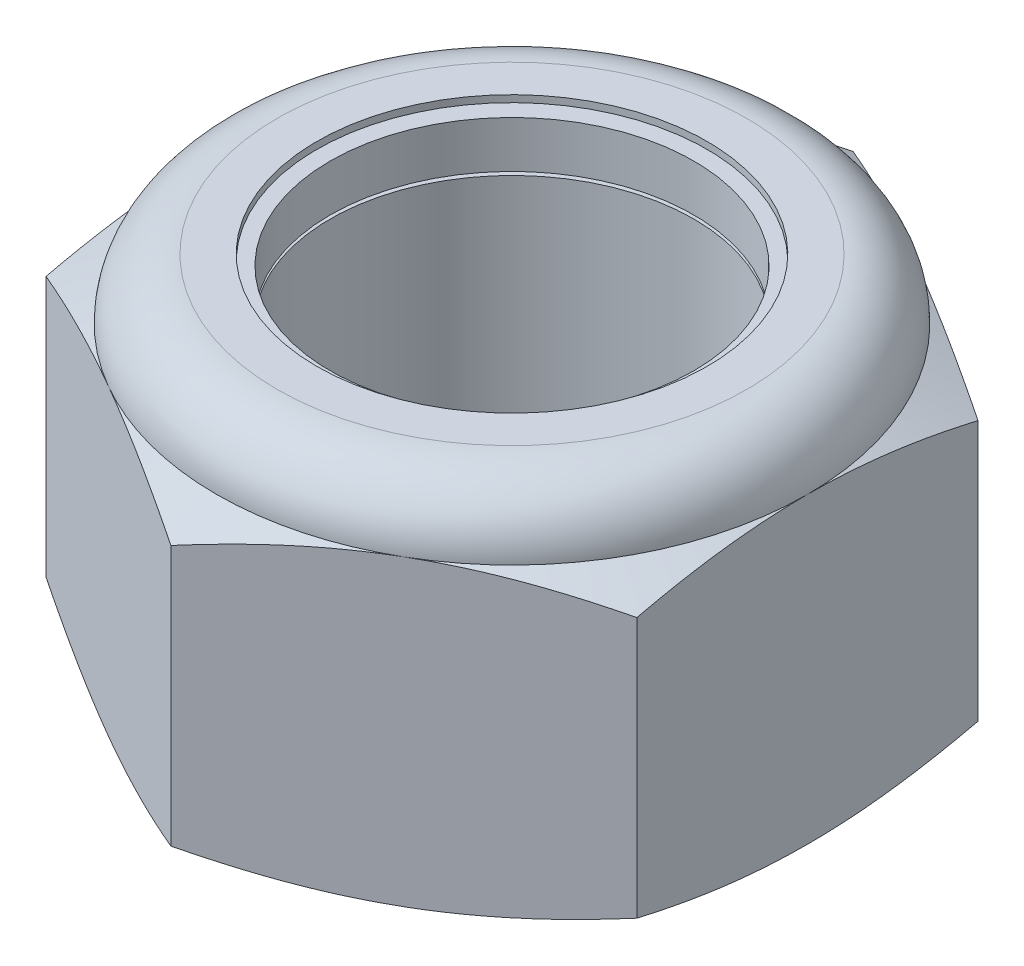
ISO-10303-21;
HEADER;
FILE_DESCRIPTION(('STEP AP214'),'2;1');
FILE_NAME('part.step','',(''),(''),'','','');
FILE_SCHEMA(('AUTOMOTIVE_DESIGN { 1 0 10303 214 1 1 1 1 }'));
ENDSEC;
DATA;
#1=APPLICATION_CONTEXT('core data for automotive mechanical design processes');
#2=APPLICATION_PROTOCOL_DEFINITION('international standard','automotive_design',2000,#1);
#3=PRODUCT_CONTEXT('',#1,'mechanical');
#4=PRODUCT('Part','Part','',(#3));
#5=PRODUCT_RELATED_PRODUCT_CATEGORY('part','',(#4));
#6=PRODUCT_DEFINITION_FORMATION('','',#4);
#7=PRODUCT_DEFINITION_CONTEXT('part definition',#1,'design');
#8=PRODUCT_DEFINITION('design','',#6,#7);
#9=PRODUCT_DEFINITION_SHAPE('','',#8);
#10=(LENGTH_UNIT() NAMED_UNIT(*) SI_UNIT(.MILLI.,.METRE.));
#11=(NAMED_UNIT(*) PLANE_ANGLE_UNIT() SI_UNIT($,.RADIAN.));
#12=(NAMED_UNIT(*) SI_UNIT($,.STERADIAN.) SOLID_ANGLE_UNIT());
#13=UNCERTAINTY_MEASURE_WITH_UNIT(LENGTH_MEASURE(1.E-05),#10,'distance_accuracy_value','');
#14=(GEOMETRIC_REPRESENTATION_CONTEXT(3) GLOBAL_UNCERTAINTY_ASSIGNED_CONTEXT((#13)) GLOBAL_UNIT_ASSIGNED_CONTEXT((#10,
#11,#12)) REPRESENTATION_CONTEXT('',''));
#15=CARTESIAN_POINT('',(0.,0.,0.));
#16=DIRECTION('',(0.,0.,1.));
#17=DIRECTION('',(1.,0.,0.));
#18=AXIS2_PLACEMENT_3D('',#15,#16,#17);
#19=CARTESIAN_POINT('',(0.,7.8476,-5.16666666666667));
#20=DIRECTION('',(0.,1.,0.));
#21=DIRECTION('',(0.,0.,-1.));
#22=AXIS2_PLACEMENT_3D('',#19,#20,#21);
#23=PLANE('',#22);
#24=CARTESIAN_POINT('',(0.,7.8476,0.));
#25=DIRECTION('',(0.,-1.,0.));
#26=DIRECTION('',(0.,0.,-1.));
#27=AXIS2_PLACEMENT_3D('',#24,#25,#26);
#28=CIRCLE('',#27,4.29131001134832);
#29=CARTESIAN_POINT('',(0.,7.8476,4.29131001134831));
#30=VERTEX_POINT('',#29);
#31=EDGE_CURVE('P0_E288',#30,#30,#28,.T.);
#32=ORIENTED_EDGE('',*,*,#31,.F.);
#33=EDGE_LOOP('',(#32));
#34=FACE_BOUND('',#33,.T.);
#35=CARTESIAN_POINT('',(0.,7.8476,0.));
#36=DIRECTION('',(0.,-1.,0.));
#37=DIRECTION('',(0.,0.,-1.));
#38=AXIS2_PLACEMENT_3D('',#35,#36,#37);
#39=CIRCLE('',#38,5.16666666666667);
#40=CARTESIAN_POINT('',(0.,7.8476,5.16666666666667));
#41=VERTEX_POINT('',#40);
#42=EDGE_CURVE('P0_E290',#41,#41,#39,.T.);
#43=ORIENTED_EDGE('',*,*,#42,.T.);
#44=EDGE_LOOP('',(#43));
#45=FACE_BOUND('',#44,.T.);
#46=ADVANCED_FACE('P0_F16',(#34,#45),#23,.F.);
#47=CARTESIAN_POINT('',(6.5,8.,-3.75277674973258));
#48=DIRECTION('',(-0.5,0.,0.866025403784439));
#49=DIRECTION('',(0.,1.,0.));
#50=AXIS2_PLACEMENT_3D('',#47,#48,#49);
#51=PLANE('',#50);
#52=DIRECTION('',(0.,-1.,0.));
#53=VECTOR('',#52,1.);
#54=CARTESIAN_POINT('',(0.,8.,-7.50555349946514));
#55=LINE('',#54,#53);
#56=CARTESIAN_POINT('',(0.,6.19776936918152,-7.50555349946514));
#57=VERTEX_POINT('',#56);
#58=CARTESIAN_POINT('',(0.,0.468897297485155,-7.50555349946514));
#59=VERTEX_POINT('',#58);
#60=EDGE_CURVE('P0_E11',#57,#59,#55,.T.);
#61=ORIENTED_EDGE('',*,*,#60,.F.);
#62=CARTESIAN_POINT('',(-8.11402595225573E-12,6.19776936917933,-7.50555349946982));
#63=CARTESIAN_POINT('',(1.74166975079905,6.66666666666667,-6.50000000000188));
#64=CARTESIAN_POINT('',(3.25000000000002,6.66666666666667,-5.62916512459884));
#65=(BOUNDED_CURVE() B_SPLINE_CURVE(2,(#62,#63,#64),.UNSPECIFIED.,.F.,
.F.) B_SPLINE_CURVE_WITH_KNOTS((3,3),(1.49446607017309,2.3298655330262),
.UNSPECIFIED.) CURVE() GEOMETRIC_REPRESENTATION_ITEM() RATIONAL_B_SPLINE_CURVE((2.10211040392093,
2.26470920953128,2.26470920953128)) REPRESENTATION_ITEM(''));
#66=CARTESIAN_POINT('',(3.25,6.66666666666667,-5.62916512459886));
#67=VERTEX_POINT('',#66);
#68=EDGE_CURVE('P0_E401',#57,#67,#65,.T.);
#69=ORIENTED_EDGE('',*,*,#68,.T.);
#70=CARTESIAN_POINT('',(3.25,6.66666666666667,-5.62916512459884));
#71=CARTESIAN_POINT('',(4.75833024920097,6.66666666666667,-4.75833024919583));
#72=CARTESIAN_POINT('',(6.50000000000809,6.19776936917933,-3.7527767497279));
#73=(BOUNDED_CURVE() B_SPLINE_CURVE(2,(#70,#71,#72),.UNSPECIFIED.,.F.,
.F.) B_SPLINE_CURVE_WITH_KNOTS((3,3),(2.32986553302619,3.16526499587929),
.UNSPECIFIED.) CURVE() GEOMETRIC_REPRESENTATION_ITEM() RATIONAL_B_SPLINE_CURVE((2.26470920953128,
2.26470920953128,2.10211040392093)) REPRESENTATION_ITEM(''));
#74=CARTESIAN_POINT('',(6.5,6.19776936918152,-3.75277674973259));
#75=VERTEX_POINT('',#74);
#76=EDGE_CURVE('P0_E247',#67,#75,#73,.T.);
#77=ORIENTED_EDGE('',*,*,#76,.T.);
#78=DIRECTION('',(0.,-1.,0.));
#79=VECTOR('',#78,1.);
#80=CARTESIAN_POINT('',(6.5,8.,-3.75277674973258));
#81=LINE('',#80,#79);
#82=CARTESIAN_POINT('',(6.5,0.468897297485152,-3.75277674973258));
#83=VERTEX_POINT('',#82);
#84=EDGE_CURVE('P0_E338',#75,#83,#81,.T.);
#85=ORIENTED_EDGE('',*,*,#84,.T.);
#86=CARTESIAN_POINT('',(6.5000000000081,0.468897297487334,-3.75277674972789));
#87=CARTESIAN_POINT('',(4.75833024920096,0.,-4.75833024919583));
#88=CARTESIAN_POINT('',(3.25,0.,-5.62916512459886));
#89=(BOUNDED_CURVE() B_SPLINE_CURVE(2,(#86,#87,#88),.UNSPECIFIED.,.F.,
.F.) B_SPLINE_CURVE_WITH_KNOTS((3,3),(1.49446607017308,2.32986553302618),
.UNSPECIFIED.) CURVE() GEOMETRIC_REPRESENTATION_ITEM() RATIONAL_B_SPLINE_CURVE((2.10211040392092,
2.26470920953127,2.26470920953127)) REPRESENTATION_ITEM(''));
#90=CARTESIAN_POINT('',(3.25,0.,-5.62916512459885));
#91=VERTEX_POINT('',#90);
#92=EDGE_CURVE('P0_E264',#83,#91,#89,.T.);
#93=ORIENTED_EDGE('',*,*,#92,.T.);
#94=CARTESIAN_POINT('',(3.25,0.,-5.62916512459886));
#95=CARTESIAN_POINT('',(1.74166975079904,0.,-6.50000000000189));
#96=CARTESIAN_POINT('',(-8.11191336478642E-12,0.468897297487337,-7.50555349946983));
#97=(BOUNDED_CURVE() B_SPLINE_CURVE(2,(#94,#95,#96),.UNSPECIFIED.,.F.,
.F.) B_SPLINE_CURVE_WITH_KNOTS((3,3),(2.32986553302618,3.16526499587928),
.UNSPECIFIED.) CURVE() GEOMETRIC_REPRESENTATION_ITEM() RATIONAL_B_SPLINE_CURVE((2.26470920953127,
2.26470920953127,2.10211040392092)) REPRESENTATION_ITEM(''));
#98=EDGE_CURVE('P0_E403',#91,#59,#97,.T.);
#99=ORIENTED_EDGE('',*,*,#98,.T.);
#100=EDGE_LOOP('',(#61,#69,#77,#85,#93,#99));
#101=FACE_BOUND('',#100,.T.);
#102=ADVANCED_FACE('P0_F500',(#101),#51,.F.);
#103=CARTESIAN_POINT('',(0.,8.,-7.50555349946514));
#104=DIRECTION('',(0.5,0.,0.866025403784439));
#105=DIRECTION('',(0.,-1.,0.));
#106=AXIS2_PLACEMENT_3D('',#103,#104,#105);
#107=PLANE('',#106);
#108=DIRECTION('',(0.,-1.,0.));
#109=VECTOR('',#108,1.);
#110=CARTESIAN_POINT('',(-6.5,8.,-3.75277674973257));
#111=LINE('',#110,#109);
#112=CARTESIAN_POINT('',(-6.5,6.19776936918152,-3.75277674973258));
#113=VERTEX_POINT('',#112);
#114=CARTESIAN_POINT('',(-6.5,0.468897297485155,-3.75277674973258));
#115=VERTEX_POINT('',#114);
#116=EDGE_CURVE('P0_E30',#113,#115,#111,.T.);
#117=ORIENTED_EDGE('',*,*,#116,.F.);
#118=CARTESIAN_POINT('',(-6.50000000000811,6.19776936917933,-3.75277674972789));
#119=CARTESIAN_POINT('',(-4.75833024920097,6.66666666666667,-4.75833024919583));
#120=CARTESIAN_POINT('',(-3.25,6.66666666666667,-5.62916512459886));
#121=(BOUNDED_CURVE() B_SPLINE_CURVE(2,(#118,#119,#120),.UNSPECIFIED.,.F.,
.F.) B_SPLINE_CURVE_WITH_KNOTS((3,3),(1.49446607017309,2.3298655330262),
.UNSPECIFIED.) CURVE() GEOMETRIC_REPRESENTATION_ITEM() RATIONAL_B_SPLINE_CURVE((2.10211040392093,
2.26470920953128,2.26470920953128)) REPRESENTATION_ITEM(''));
#122=CARTESIAN_POINT('',(-3.25,6.66666666666667,-5.62916512459886));
#123=VERTEX_POINT('',#122);
#124=EDGE_CURVE('P0_E206',#113,#123,#121,.T.);
#125=ORIENTED_EDGE('',*,*,#124,.T.);
#126=CARTESIAN_POINT('',(-3.25,6.66666666666667,-5.62916512459886));
#127=CARTESIAN_POINT('',(-1.74166975079904,6.66666666666667,-6.50000000000189));
#128=CARTESIAN_POINT('',(8.10135042743967E-12,6.19776936917933,-7.50555349946982));
#129=(BOUNDED_CURVE() B_SPLINE_CURVE(2,(#126,#127,#128),.UNSPECIFIED.,.F.,
.F.) B_SPLINE_CURVE_WITH_KNOTS((3,3),(2.3298655330262,3.16526499587929),
.UNSPECIFIED.) CURVE() GEOMETRIC_REPRESENTATION_ITEM() RATIONAL_B_SPLINE_CURVE((2.26470920953128,
2.26470920953128,2.10211040392093)) REPRESENTATION_ITEM(''));
#130=EDGE_CURVE('P0_E222',#123,#57,#129,.T.);
#131=ORIENTED_EDGE('',*,*,#130,.T.);
#132=ORIENTED_EDGE('',*,*,#60,.T.);
#133=CARTESIAN_POINT('',(8.10895574232937E-12,0.468897297487338,-7.50555349946983));
#134=CARTESIAN_POINT('',(-1.74166975079904,0.,-6.50000000000189));
#135=CARTESIAN_POINT('',(-3.25,0.,-5.62916512459886));
#136=(BOUNDED_CURVE() B_SPLINE_CURVE(2,(#133,#134,#135),.UNSPECIFIED.,.F.,
.F.) B_SPLINE_CURVE_WITH_KNOTS((3,3),(1.49446607017308,2.32986553302618),
.UNSPECIFIED.) CURVE() GEOMETRIC_REPRESENTATION_ITEM() RATIONAL_B_SPLINE_CURVE((2.10211040392092,
2.26470920953127,2.26470920953127)) REPRESENTATION_ITEM(''));
#137=CARTESIAN_POINT('',(-3.25,0.,-5.62916512459886));
#138=VERTEX_POINT('',#137);
#139=EDGE_CURVE('P0_E273',#59,#138,#136,.T.);
#140=ORIENTED_EDGE('',*,*,#139,.T.);
#141=CARTESIAN_POINT('',(-3.25,0.,-5.62916512459886));
#142=CARTESIAN_POINT('',(-4.75833024920096,0.,-4.75833024919583));
#143=CARTESIAN_POINT('',(-6.50000000000811,0.468897297487337,-3.75277674972789));
#144=(BOUNDED_CURVE() B_SPLINE_CURVE(2,(#141,#142,#143),.UNSPECIFIED.,.F.,
.F.) B_SPLINE_CURVE_WITH_KNOTS((3,3),(2.32986553302618,3.16526499587928),
.UNSPECIFIED.) CURVE() GEOMETRIC_REPRESENTATION_ITEM() RATIONAL_B_SPLINE_CURVE((2.26470920953127,
2.26470920953127,2.10211040392092)) REPRESENTATION_ITEM(''));
#145=EDGE_CURVE('P0_E228',#138,#115,#144,.T.);
#146=ORIENTED_EDGE('',*,*,#145,.T.);
#147=EDGE_LOOP('',(#117,#125,#131,#132,#140,#146));
#148=FACE_BOUND('',#147,.T.);
#149=ADVANCED_FACE('P0_F508',(#148),#107,.F.);
#150=CARTESIAN_POINT('',(-6.5,8.,-3.75277674973257));
#151=DIRECTION('',(1.,0.,0.));
#152=DIRECTION('',(0.,1.,0.));
#153=AXIS2_PLACEMENT_3D('',#150,#151,#152);
#154=PLANE('',#153);
#155=DIRECTION('',(0.,-1.,0.));
#156=VECTOR('',#155,1.);
#157=CARTESIAN_POINT('',(-6.5,8.,3.75277674973256));
#158=LINE('',#157,#156);
#159=CARTESIAN_POINT('',(-6.5,6.19776936918152,3.75277674973256));
#160=VERTEX_POINT('',#159);
#161=CARTESIAN_POINT('',(-6.5,0.468897297485155,3.75277674973256));
#162=VERTEX_POINT('',#161);
#163=EDGE_CURVE('P0_E91',#160,#162,#158,.T.);
#164=ORIENTED_EDGE('',*,*,#163,.F.);
#165=CARTESIAN_POINT('',(-6.5,6.19776936917933,3.75277674974192));
#166=CARTESIAN_POINT('',(-6.5,6.66666666666667,1.74166975080605));
#167=CARTESIAN_POINT('',(-6.5,6.66666666666667,0.));
#168=(BOUNDED_CURVE() B_SPLINE_CURVE(2,(#165,#166,#167),.UNSPECIFIED.,.F.,
.F.) B_SPLINE_CURVE_WITH_KNOTS((3,3),(1.49446607017309,2.3298655330262),
.UNSPECIFIED.) CURVE() GEOMETRIC_REPRESENTATION_ITEM() RATIONAL_B_SPLINE_CURVE((2.10211040392093,
2.26470920953128,2.26470920953128)) REPRESENTATION_ITEM(''));
#169=CARTESIAN_POINT('',(-6.5,6.66666666666667,0.));
#170=VERTEX_POINT('',#169);
#171=EDGE_CURVE('P0_E215',#160,#170,#168,.T.);
#172=ORIENTED_EDGE('',*,*,#171,.T.);
#173=CARTESIAN_POINT('',(-6.5,6.66666666666667,0.));
#174=CARTESIAN_POINT('',(-6.5,6.66666666666667,-1.74166975080608));
#175=CARTESIAN_POINT('',(-6.50000000000001,6.19776936917933,-3.75277674974195));
#176=(BOUNDED_CURVE() B_SPLINE_CURVE(2,(#173,#174,#175),.UNSPECIFIED.,.F.,
.F.) B_SPLINE_CURVE_WITH_KNOTS((3,3),(2.3298655330262,3.1652649958793),
.UNSPECIFIED.) CURVE() GEOMETRIC_REPRESENTATION_ITEM() RATIONAL_B_SPLINE_CURVE((2.26470920953128,
2.26470920953128,2.10211040392093)) REPRESENTATION_ITEM(''));
#177=EDGE_CURVE('P0_E113',#170,#113,#176,.T.);
#178=ORIENTED_EDGE('',*,*,#177,.T.);
#179=ORIENTED_EDGE('',*,*,#116,.T.);
#180=CARTESIAN_POINT('',(-6.5,0.468897297487338,-3.75277674974194));
#181=CARTESIAN_POINT('',(-6.5,0.,-1.74166975080607));
#182=CARTESIAN_POINT('',(-6.5,0.,0.));
#183=(BOUNDED_CURVE() B_SPLINE_CURVE(2,(#180,#181,#182),.UNSPECIFIED.,.F.,
.F.) B_SPLINE_CURVE_WITH_KNOTS((3,3),(1.49446607017308,2.32986553302618),
.UNSPECIFIED.) CURVE() GEOMETRIC_REPRESENTATION_ITEM() RATIONAL_B_SPLINE_CURVE((2.10211040392092,
2.26470920953127,2.26470920953127)) REPRESENTATION_ITEM(''));
#184=CARTESIAN_POINT('',(-6.5,0.,0.));
#185=VERTEX_POINT('',#184);
#186=EDGE_CURVE('P0_E240',#115,#185,#183,.T.);
#187=ORIENTED_EDGE('',*,*,#186,.T.);
#188=CARTESIAN_POINT('',(-6.5,0.,0.));
#189=CARTESIAN_POINT('',(-6.5,0.,1.74166975080605));
#190=CARTESIAN_POINT('',(-6.5,0.468897297487331,3.75277674974191));
#191=(BOUNDED_CURVE() B_SPLINE_CURVE(2,(#188,#189,#190),.UNSPECIFIED.,.F.,
.F.) B_SPLINE_CURVE_WITH_KNOTS((3,3),(2.32986553302618,3.16526499587927),
.UNSPECIFIED.) CURVE() GEOMETRIC_REPRESENTATION_ITEM() RATIONAL_B_SPLINE_CURVE((2.26470920953127,
2.26470920953127,2.10211040392092)) REPRESENTATION_ITEM(''));
#192=EDGE_CURVE('P0_E312',#185,#162,#191,.T.);
#193=ORIENTED_EDGE('',*,*,#192,.T.);
#194=EDGE_LOOP('',(#164,#172,#178,#179,#187,#193));
#195=FACE_BOUND('',#194,.T.);
#196=ADVANCED_FACE('P0_F812',(#195),#154,.F.);
#197=CARTESIAN_POINT('',(-6.5,8.,3.75277674973256));
#198=DIRECTION('',(0.5,0.,-0.866025403784439));
#199=DIRECTION('',(0.,-1.,0.));
#200=AXIS2_PLACEMENT_3D('',#197,#198,#199);
#201=PLANE('',#200);
#202=DIRECTION('',(0.,-1.,0.));
#203=VECTOR('',#202,1.);
#204=CARTESIAN_POINT('',(0.,8.,7.50555349946513));
#205=LINE('',#204,#203);
#206=CARTESIAN_POINT('',(0.,6.19776936918152,7.50555349946514));
#207=VERTEX_POINT('',#206);
#208=CARTESIAN_POINT('',(0.,0.468897297485155,7.50555349946514));
#209=VERTEX_POINT('',#208);
#210=EDGE_CURVE('P0_E339',#207,#209,#205,.T.);
#211=ORIENTED_EDGE('',*,*,#210,.F.);
#212=CARTESIAN_POINT('',(8.11106832979865E-12,6.19776936917933,7.50555349946982));
#213=CARTESIAN_POINT('',(-1.74166975079904,6.66666666666667,6.50000000000188));
#214=CARTESIAN_POINT('',(-3.25,6.66666666666667,5.62916512459884));
#215=(BOUNDED_CURVE() B_SPLINE_CURVE(2,(#212,#213,#214),.UNSPECIFIED.,.F.,
.F.) B_SPLINE_CURVE_WITH_KNOTS((3,3),(1.49446607017309,2.32986553302619),
.UNSPECIFIED.) CURVE() GEOMETRIC_REPRESENTATION_ITEM() RATIONAL_B_SPLINE_CURVE((2.10211040392093,
2.26470920953128,2.26470920953128)) REPRESENTATION_ITEM(''));
#216=CARTESIAN_POINT('',(-3.25,6.66666666666667,5.62916512459885));
#217=VERTEX_POINT('',#216);
#218=EDGE_CURVE('P0_E123',#207,#217,#215,.T.);
#219=ORIENTED_EDGE('',*,*,#218,.T.);
#220=CARTESIAN_POINT('',(-3.25,6.66666666666667,5.62916512459884));
#221=CARTESIAN_POINT('',(-4.75833024920097,6.66666666666667,4.75833024919582));
#222=CARTESIAN_POINT('',(-6.50000000000811,6.19776936917933,3.75277674972788));
#223=(BOUNDED_CURVE() B_SPLINE_CURVE(2,(#220,#221,#222),.UNSPECIFIED.,.F.,
.F.) B_SPLINE_CURVE_WITH_KNOTS((3,3),(2.32986553302619,3.1652649958793),
.UNSPECIFIED.) CURVE() GEOMETRIC_REPRESENTATION_ITEM() RATIONAL_B_SPLINE_CURVE((2.26470920953128,
2.26470920953128,2.10211040392093)) REPRESENTATION_ITEM(''));
#224=EDGE_CURVE('P0_E353',#217,#160,#223,.T.);
#225=ORIENTED_EDGE('',*,*,#224,.T.);
#226=ORIENTED_EDGE('',*,*,#163,.T.);
#227=CARTESIAN_POINT('',(-6.50000000000813,0.46889729748734,3.75277674972788));
#228=CARTESIAN_POINT('',(-4.75833024920097,0.,4.75833024919582));
#229=CARTESIAN_POINT('',(-3.25,0.,5.62916512459884));
#230=(BOUNDED_CURVE() B_SPLINE_CURVE(2,(#227,#228,#229),.UNSPECIFIED.,.F.,
.F.) B_SPLINE_CURVE_WITH_KNOTS((3,3),(1.49446607017308,2.32986553302618),
.UNSPECIFIED.) CURVE() GEOMETRIC_REPRESENTATION_ITEM() RATIONAL_B_SPLINE_CURVE((2.10211040392092,
2.26470920953127,2.26470920953127)) REPRESENTATION_ITEM(''));
#231=CARTESIAN_POINT('',(-3.25,0.,5.62916512459885));
#232=VERTEX_POINT('',#231);
#233=EDGE_CURVE('P0_E231',#162,#232,#230,.T.);
#234=ORIENTED_EDGE('',*,*,#233,.T.);
#235=CARTESIAN_POINT('',(-3.25,0.,5.62916512459884));
#236=CARTESIAN_POINT('',(-1.74166975079905,0.,6.50000000000187));
#237=CARTESIAN_POINT('',(8.08867490262365E-12,0.46889729748733,7.50555349946981));
#238=(BOUNDED_CURVE() B_SPLINE_CURVE(2,(#235,#236,#237),.UNSPECIFIED.,.F.,
.F.) B_SPLINE_CURVE_WITH_KNOTS((3,3),(2.32986553302618,3.16526499587927),
.UNSPECIFIED.) CURVE() GEOMETRIC_REPRESENTATION_ITEM() RATIONAL_B_SPLINE_CURVE((2.26470920953127,
2.26470920953127,2.10211040392092)) REPRESENTATION_ITEM(''));
#239=EDGE_CURVE('P0_E203',#232,#209,#238,.T.);
#240=ORIENTED_EDGE('',*,*,#239,.T.);
#241=EDGE_LOOP('',(#211,#219,#225,#226,#234,#240));
#242=FACE_BOUND('',#241,.T.);
#243=ADVANCED_FACE('P0_F809',(#242),#201,.F.);
#244=CARTESIAN_POINT('',(0.,8.,7.50555349946513));
#245=DIRECTION('',(-0.5,0.,-0.866025403784439));
#246=DIRECTION('',(-0.866025403784439,0.,0.5));
#247=AXIS2_PLACEMENT_3D('',#244,#245,#246);
#248=PLANE('',#247);
#249=DIRECTION('',(0.,-1.,0.));
#250=VECTOR('',#249,1.);
#251=CARTESIAN_POINT('',(6.5,8.,3.75277674973257));
#252=LINE('',#251,#250);
#253=CARTESIAN_POINT('',(6.5,6.19776936918152,3.75277674973257));
#254=VERTEX_POINT('',#253);
#255=CARTESIAN_POINT('',(6.5,0.468897297485155,3.75277674973258));
#256=VERTEX_POINT('',#255);
#257=EDGE_CURVE('P0_E41',#254,#256,#252,.T.);
#258=ORIENTED_EDGE('',*,*,#257,.F.);
#259=CARTESIAN_POINT('',(6.50000000000811,6.19776936917933,3.75277674972788));
#260=CARTESIAN_POINT('',(4.75833024920097,6.66666666666667,4.75833024919582));
#261=CARTESIAN_POINT('',(3.25000000000001,6.66666666666667,5.62916512459884));
#262=(BOUNDED_CURVE() B_SPLINE_CURVE(2,(#259,#260,#261),.UNSPECIFIED.,.F.,
.F.) B_SPLINE_CURVE_WITH_KNOTS((3,3),(1.49446607017309,2.32986553302619),
.UNSPECIFIED.) CURVE() GEOMETRIC_REPRESENTATION_ITEM() RATIONAL_B_SPLINE_CURVE((2.10211040392093,
2.26470920953128,2.26470920953128)) REPRESENTATION_ITEM(''));
#263=CARTESIAN_POINT('',(3.25,6.66666666666667,5.62916512459885));
#264=VERTEX_POINT('',#263);
#265=EDGE_CURVE('P0_E262',#254,#264,#262,.T.);
#266=ORIENTED_EDGE('',*,*,#265,.T.);
#267=CARTESIAN_POINT('',(3.25000000000001,6.66666666666667,5.62916512459884));
#268=CARTESIAN_POINT('',(1.74166975079903,6.66666666666666,6.50000000000188));
#269=CARTESIAN_POINT('',(-8.1309266520105E-12,6.19776936917933,7.50555349946982));
#270=(BOUNDED_CURVE() B_SPLINE_CURVE(2,(#267,#268,#269),.UNSPECIFIED.,.F.,
.F.) B_SPLINE_CURVE_WITH_KNOTS((3,3),(2.32986553302619,3.1652649958793),
.UNSPECIFIED.) CURVE() GEOMETRIC_REPRESENTATION_ITEM() RATIONAL_B_SPLINE_CURVE((2.26470920953128,
2.26470920953129,2.10211040392093)) REPRESENTATION_ITEM(''));
#271=EDGE_CURVE('P0_E362',#264,#207,#270,.T.);
#272=ORIENTED_EDGE('',*,*,#271,.T.);
#273=ORIENTED_EDGE('',*,*,#210,.T.);
#274=CARTESIAN_POINT('',(-8.12754651205959E-12,0.468897297487339,7.50555349946983));
#275=CARTESIAN_POINT('',(1.74166975079903,0.,6.50000000000189));
#276=CARTESIAN_POINT('',(3.25,0.,5.62916512459884));
#277=(BOUNDED_CURVE() B_SPLINE_CURVE(2,(#274,#275,#276),.UNSPECIFIED.,.F.,
.F.) B_SPLINE_CURVE_WITH_KNOTS((3,3),(1.49446607017308,2.32986553302618),
.UNSPECIFIED.) CURVE() GEOMETRIC_REPRESENTATION_ITEM() RATIONAL_B_SPLINE_CURVE((2.10211040392092,
2.26470920953127,2.26470920953127)) REPRESENTATION_ITEM(''));
#278=CARTESIAN_POINT('',(3.25,0.,5.62916512459886));
#279=VERTEX_POINT('',#278);
#280=EDGE_CURVE('P0_E219',#209,#279,#277,.T.);
#281=ORIENTED_EDGE('',*,*,#280,.T.);
#282=CARTESIAN_POINT('',(3.25,0.,5.62916512459884));
#283=CARTESIAN_POINT('',(4.75833024920097,0.,4.75833024919582));
#284=CARTESIAN_POINT('',(6.50000000000812,0.468897297487339,3.75277674972788));
#285=(BOUNDED_CURVE() B_SPLINE_CURVE(2,(#282,#283,#284),.UNSPECIFIED.,.F.,
.F.) B_SPLINE_CURVE_WITH_KNOTS((3,3),(2.32986553302618,3.16526499587928),
.UNSPECIFIED.) CURVE() GEOMETRIC_REPRESENTATION_ITEM() RATIONAL_B_SPLINE_CURVE((2.26470920953127,
2.26470920953127,2.10211040392092)) REPRESENTATION_ITEM(''));
#286=EDGE_CURVE('P0_E308',#279,#256,#285,.T.);
#287=ORIENTED_EDGE('',*,*,#286,.T.);
#288=EDGE_LOOP('',(#258,#266,#272,#273,#281,#287));
#289=FACE_BOUND('',#288,.T.);
#290=ADVANCED_FACE('P0_F667',(#289),#248,.F.);
#291=CARTESIAN_POINT('',(6.5,8.,3.75277674973257));
#292=DIRECTION('',(-1.,0.,0.));
#293=DIRECTION('',(0.,1.,0.));
#294=AXIS2_PLACEMENT_3D('',#291,#292,#293);
#295=PLANE('',#294);
#296=ORIENTED_EDGE('',*,*,#84,.F.);
#297=CARTESIAN_POINT('',(6.49999999999999,6.19776936917933,-3.75277674974196));
#298=CARTESIAN_POINT('',(6.50000000000001,6.66666666666666,-1.74166975080607));
#299=CARTESIAN_POINT('',(6.5,6.66666666666667,0.));
#300=(BOUNDED_CURVE() B_SPLINE_CURVE(2,(#297,#298,#299),.UNSPECIFIED.,.F.,
.F.) B_SPLINE_CURVE_WITH_KNOTS((3,3),(1.49446607017309,2.32986553302619),
.UNSPECIFIED.) CURVE() GEOMETRIC_REPRESENTATION_ITEM() RATIONAL_B_SPLINE_CURVE((2.10211040392093,
2.26470920953129,2.26470920953128)) REPRESENTATION_ITEM(''));
#301=CARTESIAN_POINT('',(6.5,6.66666666666667,0.));
#302=VERTEX_POINT('',#301);
#303=EDGE_CURVE('P0_E236',#75,#302,#300,.T.);
#304=ORIENTED_EDGE('',*,*,#303,.T.);
#305=CARTESIAN_POINT('',(6.5,6.66666666666667,0.));
#306=CARTESIAN_POINT('',(6.5,6.66666666666667,1.74166975080606));
#307=CARTESIAN_POINT('',(6.5,6.19776936917933,3.75277674974194));
#308=(BOUNDED_CURVE() B_SPLINE_CURVE(2,(#305,#306,#307),.UNSPECIFIED.,.F.,
.F.) B_SPLINE_CURVE_WITH_KNOTS((3,3),(2.32986553302619,3.1652649958793),
.UNSPECIFIED.) CURVE() GEOMETRIC_REPRESENTATION_ITEM() RATIONAL_B_SPLINE_CURVE((2.26470920953128,
2.26470920953128,2.10211040392093)) REPRESENTATION_ITEM(''));
#309=EDGE_CURVE('P0_E254',#302,#254,#308,.T.);
#310=ORIENTED_EDGE('',*,*,#309,.T.);
#311=ORIENTED_EDGE('',*,*,#257,.T.);
#312=CARTESIAN_POINT('',(6.5,0.468897297487339,3.75277674974195));
#313=CARTESIAN_POINT('',(6.5,0.,1.74166975080606));
#314=CARTESIAN_POINT('',(6.5,0.,0.));
#315=(BOUNDED_CURVE() B_SPLINE_CURVE(2,(#312,#313,#314),.UNSPECIFIED.,.F.,
.F.) B_SPLINE_CURVE_WITH_KNOTS((3,3),(1.49446607017307,2.32986553302618),
.UNSPECIFIED.) CURVE() GEOMETRIC_REPRESENTATION_ITEM() RATIONAL_B_SPLINE_CURVE((2.10211040392092,
2.26470920953127,2.26470920953127)) REPRESENTATION_ITEM(''));
#316=CARTESIAN_POINT('',(6.5,0.,0.));
#317=VERTEX_POINT('',#316);
#318=EDGE_CURVE('P0_E299',#256,#317,#315,.T.);
#319=ORIENTED_EDGE('',*,*,#318,.T.);
#320=CARTESIAN_POINT('',(6.5,0.,0.));
#321=CARTESIAN_POINT('',(6.5,0.,-1.74166975080607));
#322=CARTESIAN_POINT('',(6.5,0.468897297487333,-3.75277674974194));
#323=(BOUNDED_CURVE() B_SPLINE_CURVE(2,(#320,#321,#322),.UNSPECIFIED.,.F.,
.F.) B_SPLINE_CURVE_WITH_KNOTS((3,3),(2.32986553302618,3.16526499587928),
.UNSPECIFIED.) CURVE() GEOMETRIC_REPRESENTATION_ITEM() RATIONAL_B_SPLINE_CURVE((2.26470920953127,
2.26470920953127,2.10211040392092)) REPRESENTATION_ITEM(''));
#324=EDGE_CURVE('P0_E274',#317,#83,#323,.T.);
#325=ORIENTED_EDGE('',*,*,#324,.T.);
#326=EDGE_LOOP('',(#296,#304,#310,#311,#319,#325));
#327=FACE_BOUND('',#326,.T.);
#328=ADVANCED_FACE('P0_F487',(#327),#295,.F.);
#329=CARTESIAN_POINT('',(0.,6.66666666666667,0.));
#330=DIRECTION('',(0.,-1.,0.));
#331=DIRECTION('',(0.,0.,-1.));
#332=AXIS2_PLACEMENT_3D('',#329,#330,#331);
#333=CONICAL_SURFACE('',#332,6.5,1.13446401379632);
#334=ORIENTED_EDGE('',*,*,#309,.F.);
#335=CARTESIAN_POINT('',(0.,6.66666666666667,0.));
#336=DIRECTION('',(0.,-1.,0.));
#337=DIRECTION('',(0.,0.,-1.));
#338=AXIS2_PLACEMENT_3D('',#335,#336,#337);
#339=CIRCLE('',#338,6.5);
#340=EDGE_CURVE('P0_E387',#302,#264,#339,.T.);
#341=ORIENTED_EDGE('',*,*,#340,.T.);
#342=ORIENTED_EDGE('',*,*,#265,.F.);
#343=EDGE_LOOP('',(#334,#341,#342));
#344=FACE_BOUND('',#343,.T.);
#345=ADVANCED_FACE('P0_F666',(#344),#333,.T.);
#346=CARTESIAN_POINT('',(0.,6.66666666666667,0.));
#347=DIRECTION('',(0.,-1.,0.));
#348=DIRECTION('',(0.,0.,-1.));
#349=AXIS2_PLACEMENT_3D('',#346,#347,#348);
#350=CONICAL_SURFACE('',#349,6.5,1.13446401379632);
#351=CARTESIAN_POINT('',(0.,6.66666666666667,0.));
#352=DIRECTION('',(0.,-1.,0.));
#353=DIRECTION('',(0.,0.,-1.));
#354=AXIS2_PLACEMENT_3D('',#351,#352,#353);
#355=CIRCLE('',#354,6.5);
#356=EDGE_CURVE('P0_E397',#67,#302,#355,.T.);
#357=ORIENTED_EDGE('',*,*,#356,.T.);
#358=ORIENTED_EDGE('',*,*,#303,.F.);
#359=ORIENTED_EDGE('',*,*,#76,.F.);
#360=EDGE_LOOP('',(#357,#358,#359));
#361=FACE_BOUND('',#360,.T.);
#362=ADVANCED_FACE('P0_F776',(#361),#350,.T.);
#363=CARTESIAN_POINT('',(0.,6.66666666666667,0.));
#364=DIRECTION('',(0.,-1.,0.));
#365=DIRECTION('',(0.,0.,1.));
#366=AXIS2_PLACEMENT_3D('',#363,#364,#365);
#367=CONICAL_SURFACE('',#366,6.5,1.13446401379632);
#368=ORIENTED_EDGE('',*,*,#271,.F.);
#369=CARTESIAN_POINT('',(0.,6.66666666666667,0.));
#370=DIRECTION('',(0.,-1.,0.));
#371=DIRECTION('',(0.,0.,-1.));
#372=AXIS2_PLACEMENT_3D('',#369,#370,#371);
#373=CIRCLE('',#372,6.5);
#374=CARTESIAN_POINT('',(0.,6.66666666666667,6.5));
#375=VERTEX_POINT('',#374);
#376=EDGE_CURVE('P0_E133',#264,#375,#373,.T.);
#377=ORIENTED_EDGE('',*,*,#376,.T.);
#378=CARTESIAN_POINT('',(0.,6.66666666666667,0.));
#379=DIRECTION('',(0.,-1.,0.));
#380=DIRECTION('',(0.,0.,-1.));
#381=AXIS2_PLACEMENT_3D('',#378,#379,#380);
#382=CIRCLE('',#381,6.5);
#383=EDGE_CURVE('P0_E20',#375,#217,#382,.T.);
#384=ORIENTED_EDGE('',*,*,#383,.T.);
#385=ORIENTED_EDGE('',*,*,#218,.F.);
#386=EDGE_LOOP('',(#368,#377,#384,#385));
#387=FACE_BOUND('',#386,.T.);
#388=ADVANCED_FACE('P0_F772',(#387),#367,.T.);
#389=CARTESIAN_POINT('',(0.,6.66666666666667,0.));
#390=DIRECTION('',(0.,-1.,0.));
#391=DIRECTION('',(0.,0.,-1.));
#392=AXIS2_PLACEMENT_3D('',#389,#390,#391);
#393=CONICAL_SURFACE('',#392,6.5,1.13446401379632);
#394=CARTESIAN_POINT('',(0.,6.66666666666667,0.));
#395=DIRECTION('',(0.,-1.,0.));
#396=DIRECTION('',(0.,0.,-1.));
#397=AXIS2_PLACEMENT_3D('',#394,#395,#396);
#398=CIRCLE('',#397,6.5);
#399=EDGE_CURVE('P0_E226',#170,#123,#398,.T.);
#400=ORIENTED_EDGE('',*,*,#399,.T.);
#401=ORIENTED_EDGE('',*,*,#124,.F.);
#402=ORIENTED_EDGE('',*,*,#177,.F.);
#403=EDGE_LOOP('',(#400,#401,#402));
#404=FACE_BOUND('',#403,.T.);
#405=ADVANCED_FACE('P0_F755',(#404),#393,.T.);
#406=CARTESIAN_POINT('',(0.,6.66666666666667,0.));
#407=DIRECTION('',(0.,-1.,0.));
#408=DIRECTION('',(0.,0.,-1.));
#409=AXIS2_PLACEMENT_3D('',#406,#407,#408);
#410=CONICAL_SURFACE('',#409,6.5,1.13446401379632);
#411=ORIENTED_EDGE('',*,*,#224,.F.);
#412=CARTESIAN_POINT('',(0.,6.66666666666667,0.));
#413=DIRECTION('',(0.,-1.,0.));
#414=DIRECTION('',(0.,0.,-1.));
#415=AXIS2_PLACEMENT_3D('',#412,#413,#414);
#416=CIRCLE('',#415,6.5);
#417=EDGE_CURVE('P0_E225',#217,#170,#416,.T.);
#418=ORIENTED_EDGE('',*,*,#417,.T.);
#419=ORIENTED_EDGE('',*,*,#171,.F.);
#420=EDGE_LOOP('',(#411,#418,#419));
#421=FACE_BOUND('',#420,.T.);
#422=ADVANCED_FACE('P0_F685',(#421),#410,.T.);
#423=CARTESIAN_POINT('',(0.,0.468897297485155,0.));
#424=DIRECTION('',(0.,1.,0.));
#425=DIRECTION('',(0.,0.,1.));
#426=AXIS2_PLACEMENT_3D('',#423,#424,#425);
#427=CONICAL_SURFACE('',#426,7.50555349946514,1.13446401379631);
#428=CARTESIAN_POINT('',(0.,0.,0.));
#429=DIRECTION('',(0.,-1.,0.));
#430=DIRECTION('',(0.,0.,-1.));
#431=AXIS2_PLACEMENT_3D('',#428,#429,#430);
#432=CIRCLE('',#431,6.5);
#433=EDGE_CURVE('P0_E192',#232,#185,#432,.T.);
#434=ORIENTED_EDGE('',*,*,#433,.F.);
#435=ORIENTED_EDGE('',*,*,#233,.F.);
#436=ORIENTED_EDGE('',*,*,#192,.F.);
#437=EDGE_LOOP('',(#434,#435,#436));
#438=FACE_BOUND('',#437,.T.);
#439=ADVANCED_FACE('P0_F680',(#438),#427,.T.);
#440=CARTESIAN_POINT('',(0.,0.468897297485155,0.));
#441=DIRECTION('',(0.,1.,0.));
#442=DIRECTION('',(0.,0.,1.));
#443=AXIS2_PLACEMENT_3D('',#440,#441,#442);
#444=CONICAL_SURFACE('',#443,7.50555349946514,1.13446401379631);
#445=CARTESIAN_POINT('',(0.,0.,0.));
#446=DIRECTION('',(0.,-1.,0.));
#447=DIRECTION('',(0.,0.,-1.));
#448=AXIS2_PLACEMENT_3D('',#445,#446,#447);
#449=CIRCLE('',#448,6.5);
#450=EDGE_CURVE('P0_E200',#185,#138,#449,.T.);
#451=ORIENTED_EDGE('',*,*,#450,.F.);
#452=ORIENTED_EDGE('',*,*,#186,.F.);
#453=ORIENTED_EDGE('',*,*,#145,.F.);
#454=EDGE_LOOP('',(#451,#452,#453));
#455=FACE_BOUND('',#454,.T.);
#456=ADVANCED_FACE('P0_F681',(#455),#444,.T.);
#457=CARTESIAN_POINT('',(0.,0.468897297485155,0.));
#458=DIRECTION('',(0.,1.,0.));
#459=DIRECTION('',(0.,0.,-1.));
#460=AXIS2_PLACEMENT_3D('',#457,#458,#459);
#461=CONICAL_SURFACE('',#460,7.50555349946514,1.13446401379631);
#462=CARTESIAN_POINT('',(0.,0.,0.));
#463=DIRECTION('',(0.,-1.,0.));
#464=DIRECTION('',(0.,0.,-1.));
#465=AXIS2_PLACEMENT_3D('',#462,#463,#464);
#466=CIRCLE('',#465,6.5);
#467=EDGE_CURVE('P0_E295',#138,#91,#466,.T.);
#468=ORIENTED_EDGE('',*,*,#467,.F.);
#469=ORIENTED_EDGE('',*,*,#139,.F.);
#470=ORIENTED_EDGE('',*,*,#98,.F.);
#471=EDGE_LOOP('',(#468,#469,#470));
#472=FACE_BOUND('',#471,.T.);
#473=ADVANCED_FACE('P0_F503',(#472),#461,.T.);
#474=CARTESIAN_POINT('',(0.,0.468897297485155,0.));
#475=DIRECTION('',(0.,1.,0.));
#476=DIRECTION('',(0.,0.,1.));
#477=AXIS2_PLACEMENT_3D('',#474,#475,#476);
#478=CONICAL_SURFACE('',#477,7.50555349946514,1.13446401379631);
#479=ORIENTED_EDGE('',*,*,#324,.F.);
#480=CARTESIAN_POINT('',(0.,0.,0.));
#481=DIRECTION('',(0.,-1.,0.));
#482=DIRECTION('',(0.,0.,-1.));
#483=AXIS2_PLACEMENT_3D('',#480,#481,#482);
#484=CIRCLE('',#483,6.5);
#485=EDGE_CURVE('P0_E294',#91,#317,#484,.T.);
#486=ORIENTED_EDGE('',*,*,#485,.F.);
#487=ORIENTED_EDGE('',*,*,#92,.F.);
#488=EDGE_LOOP('',(#479,#486,#487));
#489=FACE_BOUND('',#488,.T.);
#490=ADVANCED_FACE('P0_F494',(#489),#478,.T.);
#491=CARTESIAN_POINT('',(0.,0.468897297485155,0.));
#492=DIRECTION('',(0.,1.,0.));
#493=DIRECTION('',(0.,0.,1.));
#494=AXIS2_PLACEMENT_3D('',#491,#492,#493);
#495=CONICAL_SURFACE('',#494,7.50555349946514,1.13446401379631);
#496=CARTESIAN_POINT('',(0.,0.,0.));
#497=DIRECTION('',(0.,-1.,0.));
#498=DIRECTION('',(0.,0.,-1.));
#499=AXIS2_PLACEMENT_3D('',#496,#497,#498);
#500=CIRCLE('',#499,6.5);
#501=EDGE_CURVE('P0_E307',#317,#279,#500,.T.);
#502=ORIENTED_EDGE('',*,*,#501,.F.);
#503=ORIENTED_EDGE('',*,*,#318,.F.);
#504=ORIENTED_EDGE('',*,*,#286,.F.);
#505=EDGE_LOOP('',(#502,#503,#504));
#506=FACE_BOUND('',#505,.T.);
#507=ADVANCED_FACE('P0_F742',(#506),#495,.T.);
#508=CARTESIAN_POINT('',(-6.5,0.,-11.2583302491977));
#509=DIRECTION('',(0.,1.,0.));
#510=DIRECTION('',(1.,0.,0.));
#511=AXIS2_PLACEMENT_3D('',#508,#509,#510);
#512=PLANE('',#511);
#513=CARTESIAN_POINT('',(0.,0.,0.));
#514=DIRECTION('',(0.,-1.,0.));
#515=DIRECTION('',(0.,0.,-1.));
#516=AXIS2_PLACEMENT_3D('',#513,#514,#515);
#517=CIRCLE('',#516,4.);
#518=CARTESIAN_POINT('',(0.,0.,4.));
#519=VERTEX_POINT('',#518);
#520=EDGE_CURVE('P0_E184',#519,#519,#517,.T.);
#521=ORIENTED_EDGE('',*,*,#520,.F.);
#522=EDGE_LOOP('',(#521));
#523=FACE_BOUND('',#522,.T.);
#524=CARTESIAN_POINT('',(0.,0.,0.));
#525=DIRECTION('',(0.,-1.,0.));
#526=DIRECTION('',(0.,0.,-1.));
#527=AXIS2_PLACEMENT_3D('',#524,#525,#526);
#528=CIRCLE('',#527,6.5);
#529=EDGE_CURVE('P0_E213',#279,#232,#528,.T.);
#530=ORIENTED_EDGE('',*,*,#529,.T.);
#531=ORIENTED_EDGE('',*,*,#433,.T.);
#532=ORIENTED_EDGE('',*,*,#450,.T.);
#533=ORIENTED_EDGE('',*,*,#467,.T.);
#534=ORIENTED_EDGE('',*,*,#485,.T.);
#535=ORIENTED_EDGE('',*,*,#501,.T.);
#536=EDGE_LOOP('',(#530,#531,#532,#533,#534,#535));
#537=FACE_BOUND('',#536,.T.);
#538=ADVANCED_FACE('P0_F734',(#523,#537),#512,.F.);
#539=CARTESIAN_POINT('',(-6.5,8.,-11.2583302491977));
#540=DIRECTION('',(0.,1.,0.));
#541=DIRECTION('',(1.,0.,0.));
#542=AXIS2_PLACEMENT_3D('',#539,#540,#541);
#543=PLANE('',#542);
#544=CARTESIAN_POINT('',(0.,8.,0.));
#545=DIRECTION('',(0.,1.,0.));
#546=DIRECTION('',(0.,0.,1.));
#547=AXIS2_PLACEMENT_3D('',#544,#545,#546);
#548=CIRCLE('',#547,4.29131001134832);
#549=CARTESIAN_POINT('',(0.,8.,4.29131001134831));
#550=VERTEX_POINT('',#549);
#551=EDGE_CURVE('P0_E283',#550,#550,#548,.T.);
#552=ORIENTED_EDGE('',*,*,#551,.F.);
#553=EDGE_LOOP('',(#552));
#554=FACE_BOUND('',#553,.T.);
#555=CARTESIAN_POINT('',(0.,8.,0.));
#556=DIRECTION('',(0.,-1.,0.));
#557=DIRECTION('',(0.,0.,-1.));
#558=AXIS2_PLACEMENT_3D('',#555,#556,#557);
#559=CIRCLE('',#558,5.16666666666667);
#560=CARTESIAN_POINT('',(0.,8.,5.16666666666667));
#561=VERTEX_POINT('',#560);
#562=EDGE_CURVE('P0_E345',#561,#561,#559,.T.);
#563=ORIENTED_EDGE('',*,*,#562,.F.);
#564=EDGE_LOOP('',(#563));
#565=FACE_BOUND('',#564,.T.);
#566=ADVANCED_FACE('P0_F739',(#554,#565),#543,.T.);
#567=CARTESIAN_POINT('',(0.,-4.,0.));
#568=DIRECTION('',(0.,-1.,0.));
#569=DIRECTION('',(0.,0.,-1.));
#570=AXIS2_PLACEMENT_3D('',#567,#568,#569);
#571=CYLINDRICAL_SURFACE('',#570,4.);
#572=CARTESIAN_POINT('',(0.,6.66666666666667,0.));
#573=DIRECTION('',(0.,1.,0.));
#574=DIRECTION('',(0.,0.,-1.));
#575=AXIS2_PLACEMENT_3D('',#572,#573,#574);
#576=CIRCLE('',#575,4.);
#577=CARTESIAN_POINT('',(0.,6.66666666666667,4.));
#578=VERTEX_POINT('',#577);
#579=EDGE_CURVE('P0_E281',#578,#578,#576,.T.);
#580=ORIENTED_EDGE('',*,*,#579,.T.);
#581=DIRECTION('',(0.,-1.,0.));
#582=VECTOR('',#581,1.);
#583=CARTESIAN_POINT('',(0.,-4.,4.));
#584=LINE('',#583,#582);
#585=EDGE_CURVE('P0_E187',#578,#519,#584,.T.);
#586=ORIENTED_EDGE('',*,*,#585,.T.);
#587=ORIENTED_EDGE('',*,*,#520,.T.);
#588=ORIENTED_EDGE('',*,*,#585,.F.);
#589=EDGE_LOOP('',(#580,#586,#587,#588));
#590=FACE_BOUND('',#589,.T.);
#591=ADVANCED_FACE('P0_F190',(#590),#571,.F.);
#592=CARTESIAN_POINT('',(0.,0.468897297485155,0.));
#593=DIRECTION('',(0.,1.,0.));
#594=DIRECTION('',(0.,0.,1.));
#595=AXIS2_PLACEMENT_3D('',#592,#593,#594);
#596=CONICAL_SURFACE('',#595,7.50555349946514,1.13446401379631);
#597=ORIENTED_EDGE('',*,*,#529,.F.);
#598=ORIENTED_EDGE('',*,*,#280,.F.);
#599=ORIENTED_EDGE('',*,*,#239,.F.);
#600=EDGE_LOOP('',(#597,#598,#599));
#601=FACE_BOUND('',#600,.T.);
#602=ADVANCED_FACE('P0_F762',(#601),#596,.T.);
#603=CARTESIAN_POINT('',(0.,6.66666666666667,0.));
#604=DIRECTION('',(0.,-1.,0.));
#605=DIRECTION('',(0.,0.,-1.));
#606=AXIS2_PLACEMENT_3D('',#603,#604,#605);
#607=CONICAL_SURFACE('',#606,6.5,1.13446401379632);
#608=CARTESIAN_POINT('',(0.,6.66666666666667,0.));
#609=DIRECTION('',(0.,-1.,0.));
#610=DIRECTION('',(0.,0.,-1.));
#611=AXIS2_PLACEMENT_3D('',#608,#609,#610);
#612=CIRCLE('',#611,6.5);
#613=EDGE_CURVE('P0_E202',#123,#67,#612,.T.);
#614=ORIENTED_EDGE('',*,*,#613,.T.);
#615=ORIENTED_EDGE('',*,*,#68,.F.);
#616=ORIENTED_EDGE('',*,*,#130,.F.);
#617=EDGE_LOOP('',(#614,#615,#616));
#618=FACE_BOUND('',#617,.T.);
#619=ADVANCED_FACE('P0_F519',(#618),#607,.T.);
#620=CARTESIAN_POINT('',(0.,6.66666666666667,0.));
#621=DIRECTION('',(0.,-1.,0.));
#622=DIRECTION('',(0.,0.,-1.));
#623=AXIS2_PLACEMENT_3D('',#620,#621,#622);
#624=TOROIDAL_SURFACE('',#623,5.16666666666667,1.33333333333333);
#625=ORIENTED_EDGE('',*,*,#613,.F.);
#626=ORIENTED_EDGE('',*,*,#399,.F.);
#627=ORIENTED_EDGE('',*,*,#417,.F.);
#628=ORIENTED_EDGE('',*,*,#383,.F.);
#629=CARTESIAN_POINT('',(0.,6.66666666666667,5.16666666666667));
#630=DIRECTION('',(-1.,0.,0.));
#631=DIRECTION('',(0.,0.,1.));
#632=AXIS2_PLACEMENT_3D('',#629,#630,#631);
#633=CIRCLE('',#632,1.33333333333333);
#634=EDGE_CURVE('P0_E340',#375,#561,#633,.T.);
#635=ORIENTED_EDGE('',*,*,#634,.T.);
#636=ORIENTED_EDGE('',*,*,#562,.T.);
#637=ORIENTED_EDGE('',*,*,#634,.F.);
#638=ORIENTED_EDGE('',*,*,#376,.F.);
#639=ORIENTED_EDGE('',*,*,#340,.F.);
#640=ORIENTED_EDGE('',*,*,#356,.F.);
#641=EDGE_LOOP('',(#625,#626,#627,#628,#635,#636,#637,#638,#639,#640));
#642=FACE_BOUND('',#641,.T.);
#643=ADVANCED_FACE('P0_F520',(#642),#624,.T.);
#644=CARTESIAN_POINT('',(0.,6.66666666666667,0.));
#645=DIRECTION('',(0.,-1.,0.));
#646=DIRECTION('',(0.,0.,-1.));
#647=AXIS2_PLACEMENT_3D('',#644,#645,#646);
#648=TOROIDAL_SURFACE('',#647,5.16666666666667,1.18093333333333);
#649=ORIENTED_EDGE('',*,*,#42,.F.);
#650=CARTESIAN_POINT('',(0.,6.66666666666667,5.16666666666667));
#651=DIRECTION('',(1.,0.,0.));
#652=DIRECTION('',(0.,0.,1.));
#653=AXIS2_PLACEMENT_3D('',#650,#651,#652);
#654=CIRCLE('',#653,1.18093333333333);
#655=CARTESIAN_POINT('',(0.,6.66666666666667,6.3476));
#656=VERTEX_POINT('',#655);
#657=EDGE_CURVE('P0_E298',#41,#656,#654,.T.);
#658=ORIENTED_EDGE('',*,*,#657,.T.);
#659=CARTESIAN_POINT('',(0.,6.66666666666667,0.));
#660=DIRECTION('',(0.,-1.,0.));
#661=DIRECTION('',(0.,0.,-1.));
#662=AXIS2_PLACEMENT_3D('',#659,#660,#661);
#663=CIRCLE('',#662,6.3476);
#664=EDGE_CURVE('P0_E285',#656,#656,#663,.T.);
#665=ORIENTED_EDGE('',*,*,#664,.T.);
#666=ORIENTED_EDGE('',*,*,#657,.F.);
#667=EDGE_LOOP('',(#649,#658,#665,#666));
#668=FACE_BOUND('',#667,.T.);
#669=ADVANCED_FACE('P0_F18',(#668),#648,.F.);
#670=CARTESIAN_POINT('',(0.,9.27,0.));
#671=DIRECTION('',(0.,-1.,0.));
#672=DIRECTION('',(0.,0.,-1.));
#673=AXIS2_PLACEMENT_3D('',#670,#671,#672);
#674=CYLINDRICAL_SURFACE('',#673,4.29131001134832);
#675=ORIENTED_EDGE('',*,*,#551,.T.);
#676=DIRECTION('',(0.,-1.,0.));
#677=VECTOR('',#676,1.);
#678=CARTESIAN_POINT('',(0.,9.27,4.29131001134831));
#679=LINE('',#678,#677);
#680=EDGE_CURVE('P0_E286',#550,#30,#679,.T.);
#681=ORIENTED_EDGE('',*,*,#680,.T.);
#682=ORIENTED_EDGE('',*,*,#31,.T.);
#683=ORIENTED_EDGE('',*,*,#680,.F.);
#684=EDGE_LOOP('',(#675,#681,#682,#683));
#685=FACE_BOUND('',#684,.T.);
#686=ADVANCED_FACE('P0_F705',(#685),#674,.F.);
#687=CARTESIAN_POINT('',(0.,6.66666666666667,0.));
#688=DIRECTION('',(0.,-1.,0.));
#689=DIRECTION('',(0.,0.,-1.));
#690=AXIS2_PLACEMENT_3D('',#687,#688,#689);
#691=PLANE('',#690);
#692=ORIENTED_EDGE('',*,*,#579,.F.);
#693=EDGE_LOOP('',(#692));
#694=FACE_BOUND('',#693,.T.);
#695=ORIENTED_EDGE('',*,*,#664,.F.);
#696=EDGE_LOOP('',(#695));
#697=FACE_BOUND('',#696,.T.);
#698=ADVANCED_FACE('P0_F710',(#694,#697),#691,.F.);
#699=CLOSED_SHELL('',(#46,#102,#149,#196,#243,#290,#328,#345,#362,#388,#405,#422,#439,#456,#473,
#490,#507,#538,#566,#591,#602,#619,#643,#669,#686,#698));
#700=MANIFOLD_SOLID_BREP('P0_B1',#699);
#701=CARTESIAN_POINT('',(0.,7.7714,-5.16666666666667));
#702=DIRECTION('',(0.,1.,0.));
#703=DIRECTION('',(0.,0.,-1.));
#704=AXIS2_PLACEMENT_3D('',#701,#702,#703);
#705=PLANE('',#704);
#706=CARTESIAN_POINT('',(0.,7.7714,0.));
#707=DIRECTION('',(0.,-1.,0.));
#708=DIRECTION('',(1.,0.,0.));
#709=AXIS2_PLACEMENT_3D('',#706,#707,#708);
#710=CIRCLE('',#709,4.);
#711=CARTESIAN_POINT('',(-4.,7.7714,0.));
#712=VERTEX_POINT('',#711);
#713=EDGE_CURVE('P1_E50',#712,#712,#710,.T.);
#714=ORIENTED_EDGE('',*,*,#713,.T.);
#715=EDGE_LOOP('',(#714));
#716=FACE_BOUND('',#715,.T.);
#717=CARTESIAN_POINT('',(0.,7.7714,0.));
#718=DIRECTION('',(0.,-1.,0.));
#719=DIRECTION('',(0.,0.,-1.));
#720=AXIS2_PLACEMENT_3D('',#717,#718,#719);
#721=CIRCLE('',#720,5.16666666666667);
#722=CARTESIAN_POINT('',(0.,7.7714,5.16666666666667));
#723=VERTEX_POINT('',#722);
#724=EDGE_CURVE('P1_E11',#723,#723,#721,.T.);
#725=ORIENTED_EDGE('',*,*,#724,.F.);
#726=EDGE_LOOP('',(#725));
#727=FACE_BOUND('',#726,.T.);
#728=ADVANCED_FACE('P1_F16',(#716,#727),#705,.T.);
#729=CARTESIAN_POINT('',(0.,6.74286666666667,-3.41595335602996));
#730=DIRECTION('',(0.,-1.,0.));
#731=DIRECTION('',(-1.,0.,0.));
#732=AXIS2_PLACEMENT_3D('',#729,#730,#731);
#733=PLANE('',#732);
#734=CARTESIAN_POINT('',(0.,6.74286666666667,0.));
#735=DIRECTION('',(0.,1.,0.));
#736=DIRECTION('',(1.,0.,0.));
#737=AXIS2_PLACEMENT_3D('',#734,#735,#736);
#738=CIRCLE('',#737,4.);
#739=CARTESIAN_POINT('',(-4.,6.74286666666667,0.));
#740=VERTEX_POINT('',#739);
#741=EDGE_CURVE('P1_E20',#740,#740,#738,.T.);
#742=ORIENTED_EDGE('',*,*,#741,.T.);
#743=EDGE_LOOP('',(#742));
#744=FACE_BOUND('',#743,.T.);
#745=CARTESIAN_POINT('',(0.,6.74286666666667,0.));
#746=DIRECTION('',(0.,-1.,0.));
#747=DIRECTION('',(0.,0.,-1.));
#748=AXIS2_PLACEMENT_3D('',#745,#746,#747);
#749=CIRCLE('',#748,6.26876888414823);
#750=CARTESIAN_POINT('',(0.,6.74286666666667,6.26876888414823));
#751=VERTEX_POINT('',#750);
#752=EDGE_CURVE('P1_E80',#751,#751,#749,.T.);
#753=ORIENTED_EDGE('',*,*,#752,.T.);
#754=EDGE_LOOP('',(#753));
#755=FACE_BOUND('',#754,.T.);
#756=ADVANCED_FACE('P1_F56',(#744,#755),#733,.T.);
#757=CARTESIAN_POINT('',(0.,6.66666666666667,0.));
#758=DIRECTION('',(0.,-1.,0.));
#759=DIRECTION('',(0.,0.,-1.));
#760=AXIS2_PLACEMENT_3D('',#757,#758,#759);
#761=TOROIDAL_SURFACE('',#760,5.16666666666667,1.10473333333333);
#762=ORIENTED_EDGE('',*,*,#752,.F.);
#763=CARTESIAN_POINT('',(0.,6.66666666666667,5.16666666666667));
#764=DIRECTION('',(-1.,0.,0.));
#765=DIRECTION('',(0.,0.,1.));
#766=AXIS2_PLACEMENT_3D('',#763,#764,#765);
#767=CIRCLE('',#766,1.10473333333333);
#768=EDGE_CURVE('P1_E30',#751,#723,#767,.T.);
#769=ORIENTED_EDGE('',*,*,#768,.T.);
#770=ORIENTED_EDGE('',*,*,#724,.T.);
#771=ORIENTED_EDGE('',*,*,#768,.F.);
#772=EDGE_LOOP('',(#762,#769,#770,#771));
#773=FACE_BOUND('',#772,.T.);
#774=ADVANCED_FACE('P1_F92',(#773),#761,.T.);
#775=CARTESIAN_POINT('',(0.,0.,0.));
#776=DIRECTION('',(0.,1.,0.));
#777=DIRECTION('',(1.,0.,0.));
#778=AXIS2_PLACEMENT_3D('',#775,#776,#777);
#779=CYLINDRICAL_SURFACE('',#778,4.);
#780=ORIENTED_EDGE('',*,*,#741,.F.);
#781=DIRECTION('',(0.,1.,0.));
#782=VECTOR('',#781,1.);
#783=CARTESIAN_POINT('',(-4.,0.,0.));
#784=LINE('',#783,#782);
#785=EDGE_CURVE('P1_E53',#740,#712,#784,.T.);
#786=ORIENTED_EDGE('',*,*,#785,.T.);
#787=ORIENTED_EDGE('',*,*,#713,.F.);
#788=ORIENTED_EDGE('',*,*,#785,.F.);
#789=EDGE_LOOP('',(#780,#786,#787,#788));
#790=FACE_BOUND('',#789,.T.);
#791=ADVANCED_FACE('P1_F18',(#790),#779,.F.);
#792=CLOSED_SHELL('',(#728,#756,#774,#791));
#793=MANIFOLD_SOLID_BREP('P1_B1',#792);
#794=ADVANCED_BREP_SHAPE_REPRESENTATION('',(#18,#700,#793),#14);
#795=SHAPE_DEFINITION_REPRESENTATION(#9,#794);
ENDSEC;
END-ISO-10303-21;
